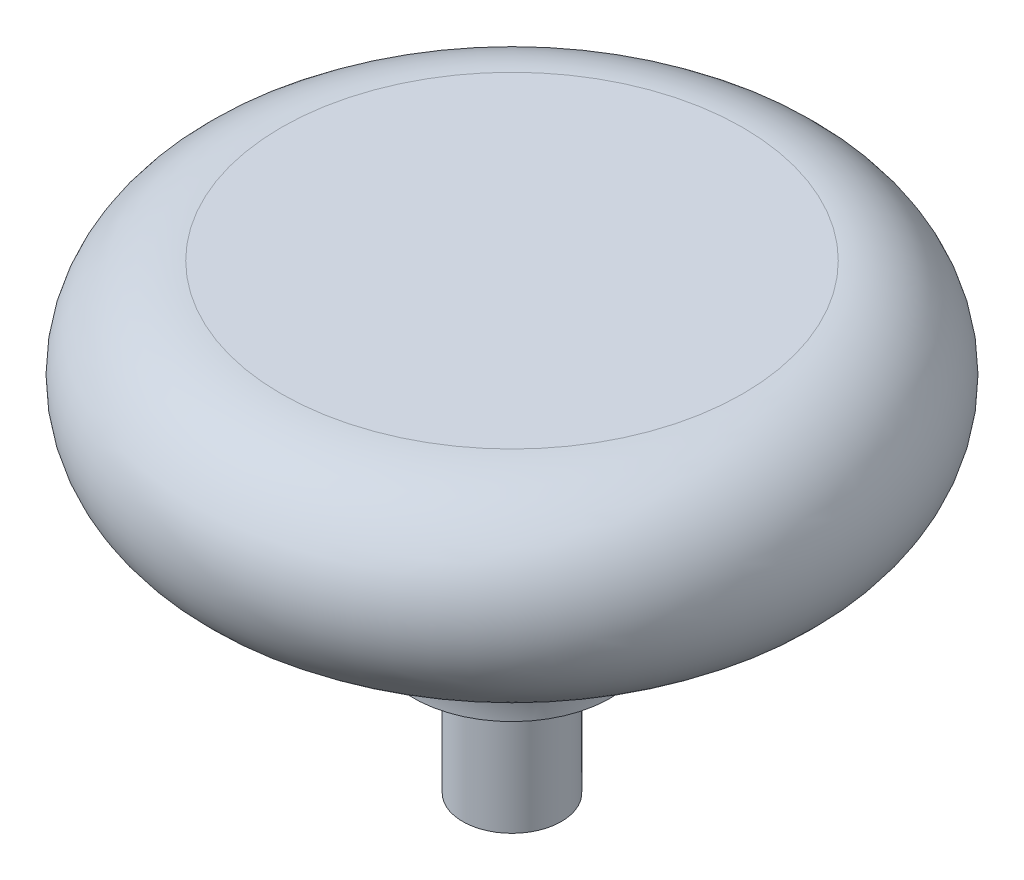
ISO-10303-21;
HEADER;
FILE_DESCRIPTION(('STEP AP214'),'2;1');
FILE_NAME('part.step','',(''),(''),'','','');
FILE_SCHEMA(('AUTOMOTIVE_DESIGN { 1 0 10303 214 1 1 1 1 }'));
ENDSEC;
DATA;
#1=APPLICATION_CONTEXT('core data for automotive mechanical design processes');
#2=APPLICATION_PROTOCOL_DEFINITION('international standard','automotive_design',2000,#1);
#3=PRODUCT_CONTEXT('',#1,'mechanical');
#4=PRODUCT('Part','Part','',(#3));
#5=PRODUCT_RELATED_PRODUCT_CATEGORY('part','',(#4));
#6=PRODUCT_DEFINITION_FORMATION('','',#4);
#7=PRODUCT_DEFINITION_CONTEXT('part definition',#1,'design');
#8=PRODUCT_DEFINITION('design','',#6,#7);
#9=PRODUCT_DEFINITION_SHAPE('','',#8);
#10=(LENGTH_UNIT() NAMED_UNIT(*) SI_UNIT(.MILLI.,.METRE.));
#11=(NAMED_UNIT(*) PLANE_ANGLE_UNIT() SI_UNIT($,.RADIAN.));
#12=(NAMED_UNIT(*) SI_UNIT($,.STERADIAN.) SOLID_ANGLE_UNIT());
#13=UNCERTAINTY_MEASURE_WITH_UNIT(LENGTH_MEASURE(1.E-05),#10,'distance_accuracy_value','');
#14=(GEOMETRIC_REPRESENTATION_CONTEXT(3) GLOBAL_UNCERTAINTY_ASSIGNED_CONTEXT((#13)) GLOBAL_UNIT_ASSIGNED_CONTEXT((#10,
#11,#12)) REPRESENTATION_CONTEXT('',''));
#15=CARTESIAN_POINT('',(0.,0.,0.));
#16=DIRECTION('',(0.,0.,1.));
#17=DIRECTION('',(1.,0.,0.));
#18=AXIS2_PLACEMENT_3D('',#15,#16,#17);
#19=CARTESIAN_POINT('',(0.,0.,0.));
#20=DIRECTION('',(0.,-1.,0.));
#21=DIRECTION('',(0.,0.,-1.));
#22=AXIS2_PLACEMENT_3D('',#19,#20,#21);
#23=TOROIDAL_SURFACE('',#22,11.12,4.76);
#24=CARTESIAN_POINT('',(0.,4.76,0.));
#25=DIRECTION('',(0.,-1.,0.));
#26=DIRECTION('',(0.,0.,-1.));
#27=AXIS2_PLACEMENT_3D('',#24,#25,#26);
#28=CIRCLE('',#27,11.12);
#29=CARTESIAN_POINT('',(0.,4.76,-11.12));
#30=VERTEX_POINT('',#29);
#31=EDGE_CURVE('E10',#30,#30,#28,.T.);
#32=ORIENTED_EDGE('',*,*,#31,.T.);
#33=EDGE_LOOP('',(#32));
#34=FACE_BOUND('',#33,.T.);
#35=CARTESIAN_POINT('',(0.,-4.75999951795357,0.));
#36=DIRECTION('',(0.,-1.,0.));
#37=DIRECTION('',(0.,0.,-1.));
#38=AXIS2_PLACEMENT_3D('',#35,#36,#37);
#39=CIRCLE('',#38,11.1178577857785);
#40=CARTESIAN_POINT('',(0.,-4.75999951795357,-11.1178577857785));
#41=VERTEX_POINT('',#40);
#42=EDGE_CURVE('E64',#41,#41,#39,.T.);
#43=ORIENTED_EDGE('',*,*,#42,.F.);
#44=EDGE_LOOP('',(#43));
#45=FACE_BOUND('',#44,.T.);
#46=ADVANCED_FACE('F37',(#34,#45),#23,.T.);
#47=CARTESIAN_POINT('',(0.,4.76,0.));
#48=DIRECTION('',(0.,1.,0.));
#49=DIRECTION('',(0.,0.,1.));
#50=AXIS2_PLACEMENT_3D('',#47,#48,#49);
#51=PLANE('',#50);
#52=ORIENTED_EDGE('',*,*,#31,.F.);
#53=EDGE_LOOP('',(#52));
#54=FACE_BOUND('',#53,.T.);
#55=ADVANCED_FACE('F73',(#54),#51,.T.);
#56=CARTESIAN_POINT('',(2.38,-17.46,0.));
#57=DIRECTION('',(0.,-1.,0.));
#58=DIRECTION('',(0.,0.,-1.));
#59=AXIS2_PLACEMENT_3D('',#56,#57,#58);
#60=PLANE('',#59);
#61=CARTESIAN_POINT('',(0.,-17.46,0.));
#62=DIRECTION('',(0.,-1.,0.));
#63=DIRECTION('',(0.,0.,-1.));
#64=AXIS2_PLACEMENT_3D('',#61,#62,#63);
#65=CIRCLE('',#64,2.38);
#66=CARTESIAN_POINT('',(0.,-17.46,-2.38));
#67=VERTEX_POINT('',#66);
#68=EDGE_CURVE('E44',#67,#67,#65,.T.);
#69=ORIENTED_EDGE('',*,*,#68,.T.);
#70=EDGE_LOOP('',(#69));
#71=FACE_BOUND('',#70,.T.);
#72=ADVANCED_FACE('F77',(#71),#60,.T.);
#73=CARTESIAN_POINT('',(0.,0.,0.));
#74=DIRECTION('',(0.,-1.,0.));
#75=DIRECTION('',(0.,0.,-1.));
#76=AXIS2_PLACEMENT_3D('',#73,#74,#75);
#77=CYLINDRICAL_SURFACE('',#76,2.38);
#78=CARTESIAN_POINT('',(0.,-11.11,0.));
#79=DIRECTION('',(0.,-1.,0.));
#80=DIRECTION('',(0.,0.,-1.));
#81=AXIS2_PLACEMENT_3D('',#78,#79,#80);
#82=CIRCLE('',#81,2.38);
#83=CARTESIAN_POINT('',(0.,-11.11,-2.38));
#84=VERTEX_POINT('',#83);
#85=EDGE_CURVE('E49',#84,#84,#82,.T.);
#86=ORIENTED_EDGE('',*,*,#85,.T.);
#87=EDGE_LOOP('',(#86));
#88=FACE_BOUND('',#87,.T.);
#89=ORIENTED_EDGE('',*,*,#68,.F.);
#90=EDGE_LOOP('',(#89));
#91=FACE_BOUND('',#90,.T.);
#92=ADVANCED_FACE('F82',(#88,#91),#77,.T.);
#93=CARTESIAN_POINT('',(4.765,-11.11,0.));
#94=DIRECTION('',(0.,-1.,0.));
#95=DIRECTION('',(0.,0.,-1.));
#96=AXIS2_PLACEMENT_3D('',#93,#94,#95);
#97=PLANE('',#96);
#98=CARTESIAN_POINT('',(0.,-11.11,0.));
#99=DIRECTION('',(0.,-1.,0.));
#100=DIRECTION('',(0.,0.,-1.));
#101=AXIS2_PLACEMENT_3D('',#98,#99,#100);
#102=CIRCLE('',#101,4.765);
#103=CARTESIAN_POINT('',(0.,-11.11,-4.765));
#104=VERTEX_POINT('',#103);
#105=EDGE_CURVE('E54',#104,#104,#102,.T.);
#106=ORIENTED_EDGE('',*,*,#105,.T.);
#107=EDGE_LOOP('',(#106));
#108=FACE_BOUND('',#107,.T.);
#109=ORIENTED_EDGE('',*,*,#85,.F.);
#110=EDGE_LOOP('',(#109));
#111=FACE_BOUND('',#110,.T.);
#112=ADVANCED_FACE('F87',(#108,#111),#97,.T.);
#113=CARTESIAN_POINT('',(0.,-11.1099988748874,0.));
#114=DIRECTION('',(0.,-1.,0.));
#115=DIRECTION('',(0.,0.,-1.));
#116=AXIS2_PLACEMENT_3D('',#113,#114,#115);
#117=TOROIDAL_SURFACE('',#116,11.1149999999999,6.35);
#118=CARTESIAN_POINT('',(0.,-4.9822108757633,0.));
#119=DIRECTION('',(0.,-1.,0.));
#120=DIRECTION('',(0.,0.,-1.));
#121=AXIS2_PLACEMENT_3D('',#118,#119,#120);
#122=CIRCLE('',#121,9.44985308822598);
#123=CARTESIAN_POINT('',(0.,-4.9822108757633,-9.44985308822598));
#124=VERTEX_POINT('',#123);
#125=EDGE_CURVE('E60',#124,#124,#122,.T.);
#126=ORIENTED_EDGE('',*,*,#125,.T.);
#127=EDGE_LOOP('',(#126));
#128=FACE_BOUND('',#127,.T.);
#129=ORIENTED_EDGE('',*,*,#105,.F.);
#130=EDGE_LOOP('',(#129));
#131=FACE_BOUND('',#130,.T.);
#132=ADVANCED_FACE('F91',(#128,#131),#117,.F.);
#133=CARTESIAN_POINT('',(0.,-4.9822108757633,0.));
#134=DIRECTION('',(0.,1.,0.));
#135=DIRECTION('',(0.,0.,1.));
#136=AXIS2_PLACEMENT_3D('',#133,#134,#135);
#137=CONICAL_SURFACE('',#136,9.44985308822598,1.43835628416847);
#138=ORIENTED_EDGE('',*,*,#42,.T.);
#139=EDGE_LOOP('',(#138));
#140=FACE_BOUND('',#139,.T.);
#141=ORIENTED_EDGE('',*,*,#125,.F.);
#142=EDGE_LOOP('',(#141));
#143=FACE_BOUND('',#142,.T.);
#144=ADVANCED_FACE('F69',(#140,#143),#137,.T.);
#145=CLOSED_SHELL('',(#46,#55,#72,#92,#112,#132,#144));
#146=MANIFOLD_SOLID_BREP('B2',#145);
#147=ADVANCED_BREP_SHAPE_REPRESENTATION('',(#18,#146),#14);
#148=SHAPE_DEFINITION_REPRESENTATION(#9,#147);
ENDSEC;
END-ISO-10303-21;
